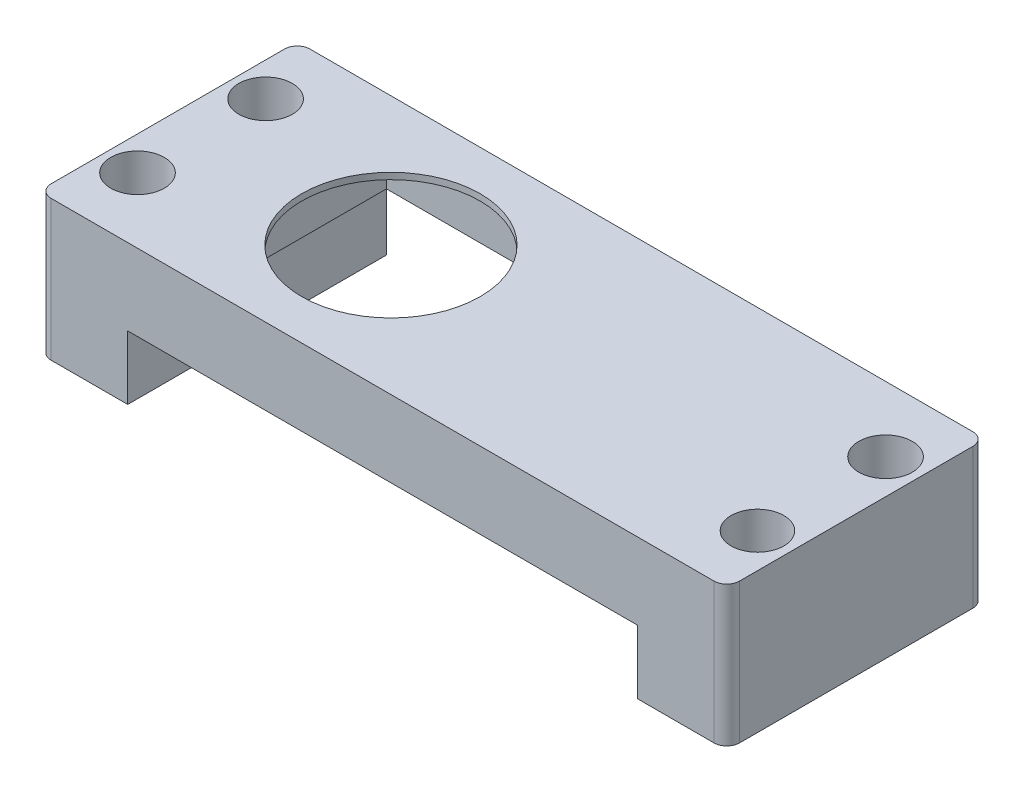
ISO-10303-21;
HEADER;
FILE_DESCRIPTION(('STEP AP214'),'2;1');
FILE_NAME('part.step','',(''),(''),'','','');
FILE_SCHEMA(('AUTOMOTIVE_DESIGN { 1 0 10303 214 1 1 1 1 }'));
ENDSEC;
DATA;
#1=APPLICATION_CONTEXT('core data for automotive mechanical design processes');
#2=APPLICATION_PROTOCOL_DEFINITION('international standard','automotive_design',2000,#1);
#3=PRODUCT_CONTEXT('',#1,'mechanical');
#4=PRODUCT('Part','Part','',(#3));
#5=PRODUCT_RELATED_PRODUCT_CATEGORY('part','',(#4));
#6=PRODUCT_DEFINITION_FORMATION('','',#4);
#7=PRODUCT_DEFINITION_CONTEXT('part definition',#1,'design');
#8=PRODUCT_DEFINITION('design','',#6,#7);
#9=PRODUCT_DEFINITION_SHAPE('','',#8);
#10=(LENGTH_UNIT() NAMED_UNIT(*) SI_UNIT(.MILLI.,.METRE.));
#11=(NAMED_UNIT(*) PLANE_ANGLE_UNIT() SI_UNIT($,.RADIAN.));
#12=(NAMED_UNIT(*) SI_UNIT($,.STERADIAN.) SOLID_ANGLE_UNIT());
#13=UNCERTAINTY_MEASURE_WITH_UNIT(LENGTH_MEASURE(1.E-05),#10,'distance_accuracy_value','');
#14=(GEOMETRIC_REPRESENTATION_CONTEXT(3) GLOBAL_UNCERTAINTY_ASSIGNED_CONTEXT((#13)) GLOBAL_UNIT_ASSIGNED_CONTEXT((#10,
#11,#12)) REPRESENTATION_CONTEXT('',''));
#15=CARTESIAN_POINT('',(0.,0.,0.));
#16=DIRECTION('',(0.,0.,1.));
#17=DIRECTION('',(1.,0.,0.));
#18=AXIS2_PLACEMENT_3D('',#15,#16,#17);
#19=CARTESIAN_POINT('',(20.,6.,10.15));
#20=DIRECTION('',(0.,0.,-1.));
#21=DIRECTION('',(-1.,0.,0.));
#22=AXIS2_PLACEMENT_3D('',#19,#20,#21);
#23=PLANE('',#22);
#24=DIRECTION('',(1.,0.,0.));
#25=VECTOR('',#24,1.);
#26=CARTESIAN_POINT('',(20.,-5.,10.15));
#27=LINE('',#26,#25);
#28=CARTESIAN_POINT('',(20.,-5.,10.15));
#29=VERTEX_POINT('',#28);
#30=CARTESIAN_POINT('',(26.,-5.,10.15));
#31=VERTEX_POINT('',#30);
#32=EDGE_CURVE('E149',#29,#31,#27,.T.);
#33=ORIENTED_EDGE('',*,*,#32,.T.);
#34=DIRECTION('',(0.,1.,0.));
#35=VECTOR('',#34,1.);
#36=CARTESIAN_POINT('',(26.,6.,10.15));
#37=LINE('',#36,#35);
#38=CARTESIAN_POINT('',(26.,6.,10.15));
#39=VERTEX_POINT('',#38);
#40=EDGE_CURVE('E250',#31,#39,#37,.T.);
#41=ORIENTED_EDGE('',*,*,#40,.T.);
#42=DIRECTION('',(1.,0.,0.));
#43=VECTOR('',#42,1.);
#44=CARTESIAN_POINT('',(20.,6.,10.15));
#45=LINE('',#44,#43);
#46=CARTESIAN_POINT('',(-26.,6.,10.15));
#47=VERTEX_POINT('',#46);
#48=EDGE_CURVE('E235',#47,#39,#45,.T.);
#49=ORIENTED_EDGE('',*,*,#48,.F.);
#50=DIRECTION('',(0.,1.,0.));
#51=VECTOR('',#50,1.);
#52=CARTESIAN_POINT('',(-26.,-5.,10.15));
#53=LINE('',#52,#51);
#54=CARTESIAN_POINT('',(-26.,-5.,10.15));
#55=VERTEX_POINT('',#54);
#56=EDGE_CURVE('E242',#47,#55,#53,.F.);
#57=ORIENTED_EDGE('',*,*,#56,.T.);
#58=DIRECTION('',(1.,0.,0.));
#59=VECTOR('',#58,1.);
#60=CARTESIAN_POINT('',(-20.,-5.,10.15));
#61=LINE('',#60,#59);
#62=CARTESIAN_POINT('',(-20.,-5.,10.15));
#63=VERTEX_POINT('',#62);
#64=EDGE_CURVE('E194',#55,#63,#61,.T.);
#65=ORIENTED_EDGE('',*,*,#64,.T.);
#66=DIRECTION('',(0.,1.,0.));
#67=VECTOR('',#66,1.);
#68=CARTESIAN_POINT('',(-20.,-5.,10.15));
#69=LINE('',#68,#67);
#70=CARTESIAN_POINT('',(-20.,0.,10.15));
#71=VERTEX_POINT('',#70);
#72=EDGE_CURVE('E199',#63,#71,#69,.T.);
#73=ORIENTED_EDGE('',*,*,#72,.T.);
#74=DIRECTION('',(1.,0.,0.));
#75=VECTOR('',#74,1.);
#76=CARTESIAN_POINT('',(20.,0.,10.15));
#77=LINE('',#76,#75);
#78=CARTESIAN_POINT('',(20.,0.,10.15));
#79=VERTEX_POINT('',#78);
#80=EDGE_CURVE('E152',#71,#79,#77,.T.);
#81=ORIENTED_EDGE('',*,*,#80,.T.);
#82=DIRECTION('',(0.,1.,0.));
#83=VECTOR('',#82,1.);
#84=CARTESIAN_POINT('',(20.,-5.,10.15));
#85=LINE('',#84,#83);
#86=EDGE_CURVE('E146',#29,#79,#85,.T.);
#87=ORIENTED_EDGE('',*,*,#86,.F.);
#88=EDGE_LOOP('',(#33,#41,#49,#57,#65,#73,#81,#87));
#89=FACE_BOUND('',#88,.T.);
#90=ADVANCED_FACE('F33',(#89),#23,.F.);
#91=CARTESIAN_POINT('',(20.,6.,-10.15));
#92=DIRECTION('',(0.,0.,1.));
#93=DIRECTION('',(1.,0.,0.));
#94=AXIS2_PLACEMENT_3D('',#91,#92,#93);
#95=PLANE('',#94);
#96=DIRECTION('',(-1.,0.,0.));
#97=VECTOR('',#96,1.);
#98=CARTESIAN_POINT('',(20.,6.,-10.15));
#99=LINE('',#98,#97);
#100=CARTESIAN_POINT('',(26.,6.,-10.15));
#101=VERTEX_POINT('',#100);
#102=CARTESIAN_POINT('',(-26.,6.,-10.15));
#103=VERTEX_POINT('',#102);
#104=EDGE_CURVE('E238',#101,#103,#99,.T.);
#105=ORIENTED_EDGE('',*,*,#104,.F.);
#106=DIRECTION('',(0.,1.,0.));
#107=VECTOR('',#106,1.);
#108=CARTESIAN_POINT('',(26.,-5.,-10.15));
#109=LINE('',#108,#107);
#110=CARTESIAN_POINT('',(26.,-5.,-10.15));
#111=VERTEX_POINT('',#110);
#112=EDGE_CURVE('E271',#101,#111,#109,.F.);
#113=ORIENTED_EDGE('',*,*,#112,.T.);
#114=DIRECTION('',(-1.,0.,0.));
#115=VECTOR('',#114,1.);
#116=CARTESIAN_POINT('',(20.,-5.,-10.15));
#117=LINE('',#116,#115);
#118=CARTESIAN_POINT('',(20.,-5.,-10.15));
#119=VERTEX_POINT('',#118);
#120=EDGE_CURVE('E158',#111,#119,#117,.T.);
#121=ORIENTED_EDGE('',*,*,#120,.T.);
#122=DIRECTION('',(0.,1.,0.));
#123=VECTOR('',#122,1.);
#124=CARTESIAN_POINT('',(20.,-5.,-10.15));
#125=LINE('',#124,#123);
#126=CARTESIAN_POINT('',(20.,0.,-10.15));
#127=VERTEX_POINT('',#126);
#128=EDGE_CURVE('E157',#119,#127,#125,.T.);
#129=ORIENTED_EDGE('',*,*,#128,.T.);
#130=DIRECTION('',(-1.,0.,0.));
#131=VECTOR('',#130,1.);
#132=CARTESIAN_POINT('',(20.,0.,-10.15));
#133=LINE('',#132,#131);
#134=CARTESIAN_POINT('',(-20.,0.,-10.15));
#135=VERTEX_POINT('',#134);
#136=EDGE_CURVE('E239',#127,#135,#133,.T.);
#137=ORIENTED_EDGE('',*,*,#136,.T.);
#138=DIRECTION('',(0.,1.,0.));
#139=VECTOR('',#138,1.);
#140=CARTESIAN_POINT('',(-20.,-5.,-10.15));
#141=LINE('',#140,#139);
#142=CARTESIAN_POINT('',(-20.,-5.,-10.15));
#143=VERTEX_POINT('',#142);
#144=EDGE_CURVE('E196',#143,#135,#141,.T.);
#145=ORIENTED_EDGE('',*,*,#144,.F.);
#146=DIRECTION('',(-1.,0.,0.));
#147=VECTOR('',#146,1.);
#148=CARTESIAN_POINT('',(-20.,-5.,-10.15));
#149=LINE('',#148,#147);
#150=CARTESIAN_POINT('',(-26.,-5.,-10.15));
#151=VERTEX_POINT('',#150);
#152=EDGE_CURVE('E189',#143,#151,#149,.T.);
#153=ORIENTED_EDGE('',*,*,#152,.T.);
#154=DIRECTION('',(0.,1.,0.));
#155=VECTOR('',#154,1.);
#156=CARTESIAN_POINT('',(-26.,6.,-10.15));
#157=LINE('',#156,#155);
#158=EDGE_CURVE('E268',#151,#103,#157,.T.);
#159=ORIENTED_EDGE('',*,*,#158,.T.);
#160=EDGE_LOOP('',(#105,#113,#121,#129,#137,#145,#153,#159));
#161=FACE_BOUND('',#160,.T.);
#162=ADVANCED_FACE('F288',(#161),#95,.F.);
#163=CARTESIAN_POINT('',(0.,6.,0.));
#164=DIRECTION('',(0.,1.,0.));
#165=DIRECTION('',(0.,0.,1.));
#166=AXIS2_PLACEMENT_3D('',#163,#164,#165);
#167=PLANE('',#166);
#168=CARTESIAN_POINT('',(-24.3575084899135,6.00000000000001,-5.025));
#169=DIRECTION('',(0.,-1.,0.));
#170=DIRECTION('',(0.,0.,-1.));
#171=AXIS2_PLACEMENT_3D('',#168,#169,#170);
#172=CIRCLE('',#171,2.1);
#173=CARTESIAN_POINT('',(-24.3575084899135,6.00000000000001,-7.125));
#174=VERTEX_POINT('',#173);
#175=EDGE_CURVE('E595',#174,#174,#172,.T.);
#176=ORIENTED_EDGE('',*,*,#175,.T.);
#177=EDGE_LOOP('',(#176));
#178=FACE_BOUND('',#177,.T.);
#179=CARTESIAN_POINT('',(-24.3575084899135,6.00000000000001,5.02500000000001));
#180=DIRECTION('',(0.,-1.,0.));
#181=DIRECTION('',(0.,0.,-1.));
#182=AXIS2_PLACEMENT_3D('',#179,#180,#181);
#183=CIRCLE('',#182,2.1);
#184=CARTESIAN_POINT('',(-24.3575084899135,6.00000000000001,2.92500000000001));
#185=VERTEX_POINT('',#184);
#186=EDGE_CURVE('E592',#185,#185,#183,.T.);
#187=ORIENTED_EDGE('',*,*,#186,.T.);
#188=EDGE_LOOP('',(#187));
#189=FACE_BOUND('',#188,.T.);
#190=CARTESIAN_POINT('',(24.2841717637674,6.00000000000001,5.02500000000001));
#191=DIRECTION('',(0.,-1.,0.));
#192=DIRECTION('',(0.,0.,-1.));
#193=AXIS2_PLACEMENT_3D('',#190,#191,#192);
#194=CIRCLE('',#193,2.07007526452974);
#195=CARTESIAN_POINT('',(24.2841717637674,6.00000000000001,2.95492473547027));
#196=VERTEX_POINT('',#195);
#197=EDGE_CURVE('E573',#196,#196,#194,.T.);
#198=ORIENTED_EDGE('',*,*,#197,.T.);
#199=EDGE_LOOP('',(#198));
#200=FACE_BOUND('',#199,.T.);
#201=CARTESIAN_POINT('',(24.2841717637674,6.00000000000001,-5.02499999999999));
#202=DIRECTION('',(0.,-1.,0.));
#203=DIRECTION('',(0.,0.,-1.));
#204=AXIS2_PLACEMENT_3D('',#201,#202,#203);
#205=CIRCLE('',#204,2.1);
#206=CARTESIAN_POINT('',(24.2841717637674,6.00000000000001,-7.12499999999999));
#207=VERTEX_POINT('',#206);
#208=EDGE_CURVE('E568',#207,#207,#205,.T.);
#209=ORIENTED_EDGE('',*,*,#208,.T.);
#210=EDGE_LOOP('',(#209));
#211=FACE_BOUND('',#210,.T.);
#212=CARTESIAN_POINT('',(-9.5,6.00000000000001,0.));
#213=DIRECTION('',(0.,1.,0.));
#214=DIRECTION('',(0.,0.,1.));
#215=AXIS2_PLACEMENT_3D('',#212,#213,#214);
#216=CIRCLE('',#215,7.);
#217=CARTESIAN_POINT('',(-9.5,6.00000000000001,7.));
#218=VERTEX_POINT('',#217);
#219=EDGE_CURVE('E564',#218,#218,#216,.T.);
#220=ORIENTED_EDGE('',*,*,#219,.F.);
#221=EDGE_LOOP('',(#220));
#222=FACE_BOUND('',#221,.T.);
#223=ORIENTED_EDGE('',*,*,#48,.T.);
#224=CARTESIAN_POINT('',(26.,6.,9.15));
#225=DIRECTION('',(0.,1.,0.));
#226=DIRECTION('',(0.,0.,1.));
#227=AXIS2_PLACEMENT_3D('',#224,#225,#226);
#228=CIRCLE('',#227,1.);
#229=CARTESIAN_POINT('',(27.,6.,9.15));
#230=VERTEX_POINT('',#229);
#231=EDGE_CURVE('E258',#39,#230,#228,.T.);
#232=ORIENTED_EDGE('',*,*,#231,.T.);
#233=DIRECTION('',(0.,0.,-1.));
#234=VECTOR('',#233,1.);
#235=CARTESIAN_POINT('',(27.,6.,10.15));
#236=LINE('',#235,#234);
#237=CARTESIAN_POINT('',(27.,6.,-9.15000000000001));
#238=VERTEX_POINT('',#237);
#239=EDGE_CURVE('E173',#230,#238,#236,.T.);
#240=ORIENTED_EDGE('',*,*,#239,.T.);
#241=CARTESIAN_POINT('',(26.,6.,-9.15000000000001));
#242=DIRECTION('',(0.,1.,0.));
#243=DIRECTION('',(0.,0.,1.));
#244=AXIS2_PLACEMENT_3D('',#241,#242,#243);
#245=CIRCLE('',#244,1.);
#246=EDGE_CURVE('E256',#238,#101,#245,.T.);
#247=ORIENTED_EDGE('',*,*,#246,.T.);
#248=ORIENTED_EDGE('',*,*,#104,.T.);
#249=CARTESIAN_POINT('',(-26.,6.,-9.15));
#250=DIRECTION('',(0.,1.,0.));
#251=DIRECTION('',(0.,0.,1.));
#252=AXIS2_PLACEMENT_3D('',#249,#250,#251);
#253=CIRCLE('',#252,1.);
#254=CARTESIAN_POINT('',(-27.,6.,-9.15));
#255=VERTEX_POINT('',#254);
#256=EDGE_CURVE('E254',#103,#255,#253,.T.);
#257=ORIENTED_EDGE('',*,*,#256,.T.);
#258=DIRECTION('',(0.,0.,1.));
#259=VECTOR('',#258,1.);
#260=CARTESIAN_POINT('',(-27.,6.,-10.15));
#261=LINE('',#260,#259);
#262=CARTESIAN_POINT('',(-27.,6.,9.15000000000001));
#263=VERTEX_POINT('',#262);
#264=EDGE_CURVE('E184',#255,#263,#261,.T.);
#265=ORIENTED_EDGE('',*,*,#264,.T.);
#266=CARTESIAN_POINT('',(-26.,6.,9.15000000000001));
#267=DIRECTION('',(0.,1.,0.));
#268=DIRECTION('',(0.,0.,1.));
#269=AXIS2_PLACEMENT_3D('',#266,#267,#268);
#270=CIRCLE('',#269,1.);
#271=EDGE_CURVE('E252',#263,#47,#270,.T.);
#272=ORIENTED_EDGE('',*,*,#271,.T.);
#273=EDGE_LOOP('',(#223,#232,#240,#247,#248,#257,#265,#272));
#274=FACE_BOUND('',#273,.T.);
#275=ADVANCED_FACE('F280',(#178,#189,#200,#211,#222,#274),#167,.T.);
#276=CARTESIAN_POINT('',(0.,0.,0.));
#277=DIRECTION('',(0.,1.,0.));
#278=DIRECTION('',(0.,0.,1.));
#279=AXIS2_PLACEMENT_3D('',#276,#277,#278);
#280=PLANE('',#279);
#281=DIRECTION('',(-1.,0.,0.));
#282=VECTOR('',#281,1.);
#283=CARTESIAN_POINT('',(20.,0.,-9.65));
#284=LINE('',#283,#282);
#285=CARTESIAN_POINT('',(19.5,0.,-9.65));
#286=VERTEX_POINT('',#285);
#287=CARTESIAN_POINT('',(-19.5,0.,-9.65));
#288=VERTEX_POINT('',#287);
#289=EDGE_CURVE('E213',#286,#288,#284,.T.);
#290=ORIENTED_EDGE('',*,*,#289,.T.);
#291=DIRECTION('',(0.,0.,1.));
#292=VECTOR('',#291,1.);
#293=CARTESIAN_POINT('',(-19.5,0.,10.15));
#294=LINE('',#293,#292);
#295=CARTESIAN_POINT('',(-19.5,0.,9.65));
#296=VERTEX_POINT('',#295);
#297=EDGE_CURVE('E201',#288,#296,#294,.T.);
#298=ORIENTED_EDGE('',*,*,#297,.T.);
#299=DIRECTION('',(1.,0.,0.));
#300=VECTOR('',#299,1.);
#301=CARTESIAN_POINT('',(20.,0.,9.65));
#302=LINE('',#301,#300);
#303=CARTESIAN_POINT('',(19.5,0.,9.65));
#304=VERTEX_POINT('',#303);
#305=EDGE_CURVE('E227',#296,#304,#302,.T.);
#306=ORIENTED_EDGE('',*,*,#305,.T.);
#307=DIRECTION('',(0.,0.,-1.));
#308=VECTOR('',#307,1.);
#309=CARTESIAN_POINT('',(19.5,0.,10.15));
#310=LINE('',#309,#308);
#311=EDGE_CURVE('E230',#304,#286,#310,.T.);
#312=ORIENTED_EDGE('',*,*,#311,.T.);
#313=EDGE_LOOP('',(#290,#298,#306,#312));
#314=FACE_BOUND('',#313,.T.);
#315=DIRECTION('',(0.,0.,1.));
#316=VECTOR('',#315,1.);
#317=CARTESIAN_POINT('',(-20.,0.,10.15));
#318=LINE('',#317,#316);
#319=EDGE_CURVE('E207',#135,#71,#318,.T.);
#320=ORIENTED_EDGE('',*,*,#319,.F.);
#321=ORIENTED_EDGE('',*,*,#136,.F.);
#322=DIRECTION('',(0.,0.,-1.));
#323=VECTOR('',#322,1.);
#324=CARTESIAN_POINT('',(20.,0.,10.15));
#325=LINE('',#324,#323);
#326=EDGE_CURVE('E246',#79,#127,#325,.T.);
#327=ORIENTED_EDGE('',*,*,#326,.F.);
#328=ORIENTED_EDGE('',*,*,#80,.F.);
#329=EDGE_LOOP('',(#320,#321,#327,#328));
#330=FACE_BOUND('',#329,.T.);
#331=ADVANCED_FACE('F353',(#314,#330),#280,.F.);
#332=CARTESIAN_POINT('',(-19.5,6.,10.15));
#333=DIRECTION('',(1.,0.,0.));
#334=DIRECTION('',(0.,0.,-1.));
#335=AXIS2_PLACEMENT_3D('',#332,#333,#334);
#336=PLANE('',#335);
#337=ORIENTED_EDGE('',*,*,#297,.F.);
#338=DIRECTION('',(0.,-1.,0.));
#339=VECTOR('',#338,1.);
#340=CARTESIAN_POINT('',(-19.5,6.,-9.65));
#341=LINE('',#340,#339);
#342=CARTESIAN_POINT('',(-19.5,5.5,-9.65));
#343=VERTEX_POINT('',#342);
#344=EDGE_CURVE('E214',#343,#288,#341,.T.);
#345=ORIENTED_EDGE('',*,*,#344,.F.);
#346=DIRECTION('',(0.,0.,1.));
#347=VECTOR('',#346,1.);
#348=CARTESIAN_POINT('',(-19.5,5.5,10.15));
#349=LINE('',#348,#347);
#350=CARTESIAN_POINT('',(-19.5,5.5,9.65));
#351=VERTEX_POINT('',#350);
#352=EDGE_CURVE('E209',#343,#351,#349,.T.);
#353=ORIENTED_EDGE('',*,*,#352,.T.);
#354=DIRECTION('',(0.,-1.,0.));
#355=VECTOR('',#354,1.);
#356=CARTESIAN_POINT('',(-19.5,6.,9.65));
#357=LINE('',#356,#355);
#358=EDGE_CURVE('E204',#351,#296,#357,.T.);
#359=ORIENTED_EDGE('',*,*,#358,.T.);
#360=EDGE_LOOP('',(#337,#345,#353,#359));
#361=FACE_BOUND('',#360,.T.);
#362=ADVANCED_FACE('F349',(#361),#336,.T.);
#363=CARTESIAN_POINT('',(20.,6.,9.65));
#364=DIRECTION('',(0.,0.,-1.));
#365=DIRECTION('',(-1.,0.,0.));
#366=AXIS2_PLACEMENT_3D('',#363,#364,#365);
#367=PLANE('',#366);
#368=ORIENTED_EDGE('',*,*,#305,.F.);
#369=ORIENTED_EDGE('',*,*,#358,.F.);
#370=DIRECTION('',(1.,0.,0.));
#371=VECTOR('',#370,1.);
#372=CARTESIAN_POINT('',(20.,5.5,9.65));
#373=LINE('',#372,#371);
#374=CARTESIAN_POINT('',(19.5,5.5,9.65));
#375=VERTEX_POINT('',#374);
#376=EDGE_CURVE('E212',#351,#375,#373,.T.);
#377=ORIENTED_EDGE('',*,*,#376,.T.);
#378=DIRECTION('',(0.,-1.,0.));
#379=VECTOR('',#378,1.);
#380=CARTESIAN_POINT('',(19.5,6.,9.65));
#381=LINE('',#380,#379);
#382=EDGE_CURVE('E208',#375,#304,#381,.T.);
#383=ORIENTED_EDGE('',*,*,#382,.T.);
#384=EDGE_LOOP('',(#368,#369,#377,#383));
#385=FACE_BOUND('',#384,.T.);
#386=ADVANCED_FACE('F352',(#385),#367,.T.);
#387=CARTESIAN_POINT('',(19.5,6.,10.15));
#388=DIRECTION('',(-1.,0.,0.));
#389=DIRECTION('',(0.,0.,1.));
#390=AXIS2_PLACEMENT_3D('',#387,#388,#389);
#391=PLANE('',#390);
#392=ORIENTED_EDGE('',*,*,#311,.F.);
#393=ORIENTED_EDGE('',*,*,#382,.F.);
#394=DIRECTION('',(0.,0.,-1.));
#395=VECTOR('',#394,1.);
#396=CARTESIAN_POINT('',(19.5,5.5,10.15));
#397=LINE('',#396,#395);
#398=CARTESIAN_POINT('',(19.5,5.5,-9.65));
#399=VERTEX_POINT('',#398);
#400=EDGE_CURVE('E221',#375,#399,#397,.T.);
#401=ORIENTED_EDGE('',*,*,#400,.T.);
#402=DIRECTION('',(0.,-1.,0.));
#403=VECTOR('',#402,1.);
#404=CARTESIAN_POINT('',(19.5,6.,-9.65));
#405=LINE('',#404,#403);
#406=EDGE_CURVE('E216',#399,#286,#405,.T.);
#407=ORIENTED_EDGE('',*,*,#406,.T.);
#408=EDGE_LOOP('',(#392,#393,#401,#407));
#409=FACE_BOUND('',#408,.T.);
#410=ADVANCED_FACE('F357',(#409),#391,.T.);
#411=CARTESIAN_POINT('',(20.,6.,-9.65));
#412=DIRECTION('',(0.,0.,1.));
#413=DIRECTION('',(1.,0.,0.));
#414=AXIS2_PLACEMENT_3D('',#411,#412,#413);
#415=PLANE('',#414);
#416=ORIENTED_EDGE('',*,*,#289,.F.);
#417=ORIENTED_EDGE('',*,*,#406,.F.);
#418=DIRECTION('',(-1.,0.,0.));
#419=VECTOR('',#418,1.);
#420=CARTESIAN_POINT('',(20.,5.5,-9.65));
#421=LINE('',#420,#419);
#422=EDGE_CURVE('E217',#399,#343,#421,.T.);
#423=ORIENTED_EDGE('',*,*,#422,.T.);
#424=ORIENTED_EDGE('',*,*,#344,.T.);
#425=EDGE_LOOP('',(#416,#417,#423,#424));
#426=FACE_BOUND('',#425,.T.);
#427=ADVANCED_FACE('F361',(#426),#415,.T.);
#428=CARTESIAN_POINT('',(0.,5.5,0.));
#429=DIRECTION('',(0.,1.,0.));
#430=DIRECTION('',(0.,0.,1.));
#431=AXIS2_PLACEMENT_3D('',#428,#429,#430);
#432=PLANE('',#431);
#433=CARTESIAN_POINT('',(-9.5,5.5,0.));
#434=DIRECTION('',(0.,-1.,0.));
#435=DIRECTION('',(0.,0.,-1.));
#436=AXIS2_PLACEMENT_3D('',#433,#434,#435);
#437=CIRCLE('',#436,7.);
#438=CARTESIAN_POINT('',(-9.5,5.5,-7.));
#439=VERTEX_POINT('',#438);
#440=EDGE_CURVE('E567',#439,#439,#437,.T.);
#441=ORIENTED_EDGE('',*,*,#440,.F.);
#442=EDGE_LOOP('',(#441));
#443=FACE_BOUND('',#442,.T.);
#444=ORIENTED_EDGE('',*,*,#352,.F.);
#445=ORIENTED_EDGE('',*,*,#422,.F.);
#446=ORIENTED_EDGE('',*,*,#400,.F.);
#447=ORIENTED_EDGE('',*,*,#376,.F.);
#448=EDGE_LOOP('',(#444,#445,#446,#447));
#449=FACE_BOUND('',#448,.T.);
#450=ADVANCED_FACE('F348',(#443,#449),#432,.F.);
#451=CARTESIAN_POINT('',(-20.,-5.,-10.15));
#452=DIRECTION('',(1.,0.,0.));
#453=DIRECTION('',(0.,0.,-1.));
#454=AXIS2_PLACEMENT_3D('',#451,#452,#453);
#455=PLANE('',#454);
#456=ORIENTED_EDGE('',*,*,#144,.T.);
#457=ORIENTED_EDGE('',*,*,#319,.T.);
#458=ORIENTED_EDGE('',*,*,#72,.F.);
#459=DIRECTION('',(0.,0.,-1.));
#460=VECTOR('',#459,1.);
#461=CARTESIAN_POINT('',(-20.,-5.,-10.15));
#462=LINE('',#461,#460);
#463=EDGE_CURVE('E186',#63,#143,#462,.T.);
#464=ORIENTED_EDGE('',*,*,#463,.T.);
#465=EDGE_LOOP('',(#456,#457,#458,#464));
#466=FACE_BOUND('',#465,.T.);
#467=ADVANCED_FACE('F295',(#466),#455,.T.);
#468=CARTESIAN_POINT('',(-27.,-5.,-10.15));
#469=DIRECTION('',(-1.,0.,0.));
#470=DIRECTION('',(0.,0.,1.));
#471=AXIS2_PLACEMENT_3D('',#468,#469,#470);
#472=PLANE('',#471);
#473=ORIENTED_EDGE('',*,*,#264,.F.);
#474=DIRECTION('',(0.,1.,0.));
#475=VECTOR('',#474,1.);
#476=CARTESIAN_POINT('',(-27.,-5.,-9.15));
#477=LINE('',#476,#475);
#478=CARTESIAN_POINT('',(-27.,-5.,-9.15));
#479=VERTEX_POINT('',#478);
#480=EDGE_CURVE('E54',#255,#479,#477,.F.);
#481=ORIENTED_EDGE('',*,*,#480,.T.);
#482=DIRECTION('',(0.,0.,1.));
#483=VECTOR('',#482,1.);
#484=CARTESIAN_POINT('',(-27.,-5.,-10.15));
#485=LINE('',#484,#483);
#486=CARTESIAN_POINT('',(-27.,-5.,9.15000000000001));
#487=VERTEX_POINT('',#486);
#488=EDGE_CURVE('E192',#479,#487,#485,.T.);
#489=ORIENTED_EDGE('',*,*,#488,.T.);
#490=DIRECTION('',(0.,1.,0.));
#491=VECTOR('',#490,1.);
#492=CARTESIAN_POINT('',(-27.,6.,9.15000000000001));
#493=LINE('',#492,#491);
#494=EDGE_CURVE('E273',#487,#263,#493,.T.);
#495=ORIENTED_EDGE('',*,*,#494,.T.);
#496=EDGE_LOOP('',(#473,#481,#489,#495));
#497=FACE_BOUND('',#496,.T.);
#498=ADVANCED_FACE('F277',(#497),#472,.T.);
#499=CARTESIAN_POINT('',(0.,-5.,0.));
#500=DIRECTION('',(0.,-1.,0.));
#501=DIRECTION('',(0.,0.,-1.));
#502=AXIS2_PLACEMENT_3D('',#499,#500,#501);
#503=PLANE('',#502);
#504=CARTESIAN_POINT('',(-24.3575084899135,-5.,-5.025));
#505=DIRECTION('',(0.,-1.,0.));
#506=DIRECTION('',(0.,0.,-1.));
#507=AXIS2_PLACEMENT_3D('',#504,#505,#506);
#508=CIRCLE('',#507,2.1);
#509=CARTESIAN_POINT('',(-24.3575084899135,-5.,-7.125));
#510=VERTEX_POINT('',#509);
#511=EDGE_CURVE('E580',#510,#510,#508,.T.);
#512=ORIENTED_EDGE('',*,*,#511,.F.);
#513=EDGE_LOOP('',(#512));
#514=FACE_BOUND('',#513,.T.);
#515=CARTESIAN_POINT('',(-24.3575084899135,-5.,5.02500000000001));
#516=DIRECTION('',(0.,-1.,0.));
#517=DIRECTION('',(0.,0.,-1.));
#518=AXIS2_PLACEMENT_3D('',#515,#516,#517);
#519=CIRCLE('',#518,2.1);
#520=CARTESIAN_POINT('',(-24.3575084899135,-5.,2.92500000000001));
#521=VERTEX_POINT('',#520);
#522=EDGE_CURVE('E577',#521,#521,#519,.T.);
#523=ORIENTED_EDGE('',*,*,#522,.F.);
#524=EDGE_LOOP('',(#523));
#525=FACE_BOUND('',#524,.T.);
#526=ORIENTED_EDGE('',*,*,#488,.F.);
#527=CARTESIAN_POINT('',(-26.,-5.,-9.15));
#528=DIRECTION('',(0.,-1.,0.));
#529=DIRECTION('',(0.,0.,-1.));
#530=AXIS2_PLACEMENT_3D('',#527,#528,#529);
#531=CIRCLE('',#530,1.);
#532=EDGE_CURVE('E11',#479,#151,#531,.T.);
#533=ORIENTED_EDGE('',*,*,#532,.T.);
#534=ORIENTED_EDGE('',*,*,#152,.F.);
#535=ORIENTED_EDGE('',*,*,#463,.F.);
#536=ORIENTED_EDGE('',*,*,#64,.F.);
#537=CARTESIAN_POINT('',(-26.,-5.,9.15000000000001));
#538=DIRECTION('',(0.,-1.,0.));
#539=DIRECTION('',(0.,0.,-1.));
#540=AXIS2_PLACEMENT_3D('',#537,#538,#539);
#541=CIRCLE('',#540,1.);
#542=EDGE_CURVE('E41',#55,#487,#541,.T.);
#543=ORIENTED_EDGE('',*,*,#542,.T.);
#544=EDGE_LOOP('',(#526,#533,#534,#535,#536,#543));
#545=FACE_BOUND('',#544,.T.);
#546=ADVANCED_FACE('F292',(#514,#525,#545),#503,.T.);
#547=CARTESIAN_POINT('',(20.,-5.,10.15));
#548=DIRECTION('',(-1.,0.,0.));
#549=DIRECTION('',(0.,0.,1.));
#550=AXIS2_PLACEMENT_3D('',#547,#548,#549);
#551=PLANE('',#550);
#552=ORIENTED_EDGE('',*,*,#86,.T.);
#553=ORIENTED_EDGE('',*,*,#326,.T.);
#554=ORIENTED_EDGE('',*,*,#128,.F.);
#555=DIRECTION('',(0.,0.,1.));
#556=VECTOR('',#555,1.);
#557=CARTESIAN_POINT('',(20.,-5.,10.15));
#558=LINE('',#557,#556);
#559=EDGE_CURVE('E165',#119,#29,#558,.T.);
#560=ORIENTED_EDGE('',*,*,#559,.T.);
#561=EDGE_LOOP('',(#552,#553,#554,#560));
#562=FACE_BOUND('',#561,.T.);
#563=ADVANCED_FACE('F171',(#562),#551,.T.);
#564=CARTESIAN_POINT('',(27.,-5.,10.15));
#565=DIRECTION('',(1.,0.,0.));
#566=DIRECTION('',(0.,0.,-1.));
#567=AXIS2_PLACEMENT_3D('',#564,#565,#566);
#568=PLANE('',#567);
#569=ORIENTED_EDGE('',*,*,#239,.F.);
#570=DIRECTION('',(0.,1.,0.));
#571=VECTOR('',#570,1.);
#572=CARTESIAN_POINT('',(27.,-5.,9.15));
#573=LINE('',#572,#571);
#574=CARTESIAN_POINT('',(27.,-5.,9.15));
#575=VERTEX_POINT('',#574);
#576=EDGE_CURVE('E263',#230,#575,#573,.F.);
#577=ORIENTED_EDGE('',*,*,#576,.T.);
#578=DIRECTION('',(0.,0.,-1.));
#579=VECTOR('',#578,1.);
#580=CARTESIAN_POINT('',(27.,-5.,10.15));
#581=LINE('',#580,#579);
#582=CARTESIAN_POINT('',(27.,-5.,-9.15000000000001));
#583=VERTEX_POINT('',#582);
#584=EDGE_CURVE('E168',#575,#583,#581,.T.);
#585=ORIENTED_EDGE('',*,*,#584,.T.);
#586=DIRECTION('',(0.,1.,0.));
#587=VECTOR('',#586,1.);
#588=CARTESIAN_POINT('',(27.,6.,-9.15000000000001));
#589=LINE('',#588,#587);
#590=EDGE_CURVE('E260',#583,#238,#589,.T.);
#591=ORIENTED_EDGE('',*,*,#590,.T.);
#592=EDGE_LOOP('',(#569,#577,#585,#591));
#593=FACE_BOUND('',#592,.T.);
#594=ADVANCED_FACE('F329',(#593),#568,.T.);
#595=CARTESIAN_POINT('',(0.,-5.,0.));
#596=DIRECTION('',(0.,-1.,0.));
#597=DIRECTION('',(0.,0.,-1.));
#598=AXIS2_PLACEMENT_3D('',#595,#596,#597);
#599=PLANE('',#598);
#600=CARTESIAN_POINT('',(24.2841717637674,-5.,-5.02499999999999));
#601=DIRECTION('',(0.,-1.,0.));
#602=DIRECTION('',(0.,0.,-1.));
#603=AXIS2_PLACEMENT_3D('',#600,#601,#602);
#604=CIRCLE('',#603,2.1);
#605=CARTESIAN_POINT('',(24.2841717637674,-5.,-7.12499999999999));
#606=VERTEX_POINT('',#605);
#607=EDGE_CURVE('E570',#606,#606,#604,.T.);
#608=ORIENTED_EDGE('',*,*,#607,.F.);
#609=EDGE_LOOP('',(#608));
#610=FACE_BOUND('',#609,.T.);
#611=CARTESIAN_POINT('',(24.2841717637674,-5.,5.02500000000001));
#612=DIRECTION('',(0.,-1.,0.));
#613=DIRECTION('',(0.,0.,-1.));
#614=AXIS2_PLACEMENT_3D('',#611,#612,#613);
#615=CIRCLE('',#614,2.07007526452974);
#616=CARTESIAN_POINT('',(24.2841717637674,-5.,2.95492473547027));
#617=VERTEX_POINT('',#616);
#618=EDGE_CURVE('E176',#617,#617,#615,.T.);
#619=ORIENTED_EDGE('',*,*,#618,.F.);
#620=EDGE_LOOP('',(#619));
#621=FACE_BOUND('',#620,.T.);
#622=ORIENTED_EDGE('',*,*,#584,.F.);
#623=CARTESIAN_POINT('',(26.,-5.,9.15));
#624=DIRECTION('',(0.,-1.,0.));
#625=DIRECTION('',(0.,0.,-1.));
#626=AXIS2_PLACEMENT_3D('',#623,#624,#625);
#627=CIRCLE('',#626,1.);
#628=EDGE_CURVE('E167',#575,#31,#627,.T.);
#629=ORIENTED_EDGE('',*,*,#628,.T.);
#630=ORIENTED_EDGE('',*,*,#32,.F.);
#631=ORIENTED_EDGE('',*,*,#559,.F.);
#632=ORIENTED_EDGE('',*,*,#120,.F.);
#633=CARTESIAN_POINT('',(26.,-5.,-9.15000000000001));
#634=DIRECTION('',(0.,-1.,0.));
#635=DIRECTION('',(0.,0.,-1.));
#636=AXIS2_PLACEMENT_3D('',#633,#634,#635);
#637=CIRCLE('',#636,1.);
#638=EDGE_CURVE('E265',#111,#583,#637,.T.);
#639=ORIENTED_EDGE('',*,*,#638,.T.);
#640=EDGE_LOOP('',(#622,#629,#630,#631,#632,#639));
#641=FACE_BOUND('',#640,.T.);
#642=ADVANCED_FACE('F163',(#610,#621,#641),#599,.T.);
#643=CARTESIAN_POINT('',(26.,6.,9.15));
#644=DIRECTION('',(0.,-1.,0.));
#645=DIRECTION('',(0.,0.,-1.));
#646=AXIS2_PLACEMENT_3D('',#643,#644,#645);
#647=CYLINDRICAL_SURFACE('',#646,1.);
#648=ORIENTED_EDGE('',*,*,#628,.F.);
#649=ORIENTED_EDGE('',*,*,#576,.F.);
#650=ORIENTED_EDGE('',*,*,#231,.F.);
#651=ORIENTED_EDGE('',*,*,#40,.F.);
#652=EDGE_LOOP('',(#648,#649,#650,#651));
#653=FACE_BOUND('',#652,.T.);
#654=ADVANCED_FACE('F317',(#653),#647,.T.);
#655=CARTESIAN_POINT('',(26.,-5.,-9.15000000000001));
#656=DIRECTION('',(0.,-1.,0.));
#657=DIRECTION('',(0.,0.,-1.));
#658=AXIS2_PLACEMENT_3D('',#655,#656,#657);
#659=CYLINDRICAL_SURFACE('',#658,1.);
#660=ORIENTED_EDGE('',*,*,#638,.F.);
#661=ORIENTED_EDGE('',*,*,#112,.F.);
#662=ORIENTED_EDGE('',*,*,#246,.F.);
#663=ORIENTED_EDGE('',*,*,#590,.F.);
#664=EDGE_LOOP('',(#660,#661,#662,#663));
#665=FACE_BOUND('',#664,.T.);
#666=ADVANCED_FACE('F308',(#665),#659,.T.);
#667=CARTESIAN_POINT('',(-26.,6.,-9.15));
#668=DIRECTION('',(0.,-1.,0.));
#669=DIRECTION('',(0.,0.,-1.));
#670=AXIS2_PLACEMENT_3D('',#667,#668,#669);
#671=CYLINDRICAL_SURFACE('',#670,1.);
#672=ORIENTED_EDGE('',*,*,#532,.F.);
#673=ORIENTED_EDGE('',*,*,#480,.F.);
#674=ORIENTED_EDGE('',*,*,#256,.F.);
#675=ORIENTED_EDGE('',*,*,#158,.F.);
#676=EDGE_LOOP('',(#672,#673,#674,#675));
#677=FACE_BOUND('',#676,.T.);
#678=ADVANCED_FACE('F286',(#677),#671,.T.);
#679=CARTESIAN_POINT('',(-26.,-5.,9.15000000000001));
#680=DIRECTION('',(0.,-1.,0.));
#681=DIRECTION('',(0.,0.,-1.));
#682=AXIS2_PLACEMENT_3D('',#679,#680,#681);
#683=CYLINDRICAL_SURFACE('',#682,1.);
#684=ORIENTED_EDGE('',*,*,#542,.F.);
#685=ORIENTED_EDGE('',*,*,#56,.F.);
#686=ORIENTED_EDGE('',*,*,#271,.F.);
#687=ORIENTED_EDGE('',*,*,#494,.F.);
#688=EDGE_LOOP('',(#684,#685,#686,#687));
#689=FACE_BOUND('',#688,.T.);
#690=ADVANCED_FACE('F35',(#689),#683,.T.);
#691=CARTESIAN_POINT('',(24.2841717637674,1.,5.02500000000001));
#692=DIRECTION('',(0.,-1.,0.));
#693=DIRECTION('',(0.,0.,-1.));
#694=AXIS2_PLACEMENT_3D('',#691,#692,#693);
#695=CYLINDRICAL_SURFACE('',#694,2.07007526452974);
#696=ORIENTED_EDGE('',*,*,#618,.T.);
#697=EDGE_LOOP('',(#696));
#698=FACE_BOUND('',#697,.T.);
#699=ORIENTED_EDGE('',*,*,#197,.F.);
#700=EDGE_LOOP('',(#699));
#701=FACE_BOUND('',#700,.T.);
#702=ADVANCED_FACE('F299',(#698,#701),#695,.F.);
#703=CARTESIAN_POINT('',(24.2841717637674,1.,-5.02499999999999));
#704=DIRECTION('',(0.,-1.,0.));
#705=DIRECTION('',(0.,0.,-1.));
#706=AXIS2_PLACEMENT_3D('',#703,#704,#705);
#707=CYLINDRICAL_SURFACE('',#706,2.1);
#708=ORIENTED_EDGE('',*,*,#607,.T.);
#709=EDGE_LOOP('',(#708));
#710=FACE_BOUND('',#709,.T.);
#711=ORIENTED_EDGE('',*,*,#208,.F.);
#712=EDGE_LOOP('',(#711));
#713=FACE_BOUND('',#712,.T.);
#714=ADVANCED_FACE('F305',(#710,#713),#707,.F.);
#715=CARTESIAN_POINT('',(-24.3575084899135,1.,5.02500000000001));
#716=DIRECTION('',(0.,-1.,0.));
#717=DIRECTION('',(0.,0.,-1.));
#718=AXIS2_PLACEMENT_3D('',#715,#716,#717);
#719=CYLINDRICAL_SURFACE('',#718,2.1);
#720=ORIENTED_EDGE('',*,*,#522,.T.);
#721=EDGE_LOOP('',(#720));
#722=FACE_BOUND('',#721,.T.);
#723=ORIENTED_EDGE('',*,*,#186,.F.);
#724=EDGE_LOOP('',(#723));
#725=FACE_BOUND('',#724,.T.);
#726=ADVANCED_FACE('F519',(#722,#725),#719,.F.);
#727=CARTESIAN_POINT('',(-24.3575084899135,1.,-5.025));
#728=DIRECTION('',(0.,-1.,0.));
#729=DIRECTION('',(0.,0.,-1.));
#730=AXIS2_PLACEMENT_3D('',#727,#728,#729);
#731=CYLINDRICAL_SURFACE('',#730,2.1);
#732=ORIENTED_EDGE('',*,*,#511,.T.);
#733=EDGE_LOOP('',(#732));
#734=FACE_BOUND('',#733,.T.);
#735=ORIENTED_EDGE('',*,*,#175,.F.);
#736=EDGE_LOOP('',(#735));
#737=FACE_BOUND('',#736,.T.);
#738=ADVANCED_FACE('F530',(#734,#737),#731,.F.);
#739=CARTESIAN_POINT('',(-9.5,93.5,0.));
#740=DIRECTION('',(0.,-1.,0.));
#741=DIRECTION('',(0.,0.,-1.));
#742=AXIS2_PLACEMENT_3D('',#739,#740,#741);
#743=CYLINDRICAL_SURFACE('',#742,7.);
#744=ORIENTED_EDGE('',*,*,#219,.T.);
#745=EDGE_LOOP('',(#744));
#746=FACE_BOUND('',#745,.T.);
#747=ORIENTED_EDGE('',*,*,#440,.T.);
#748=EDGE_LOOP('',(#747));
#749=FACE_BOUND('',#748,.T.);
#750=ADVANCED_FACE('F540',(#746,#749),#743,.F.);
#751=CLOSED_SHELL('',(#90,#162,#275,#331,#362,#386,#410,#427,#450,#467,#498,#546,#563,#594,#642,
#654,#666,#678,#690,#702,#714,#726,#738,#750));
#752=MANIFOLD_SOLID_BREP('B2',#751);
#753=ADVANCED_BREP_SHAPE_REPRESENTATION('',(#18,#752),#14);
#754=SHAPE_DEFINITION_REPRESENTATION(#9,#753);
ENDSEC;
END-ISO-10303-21;
